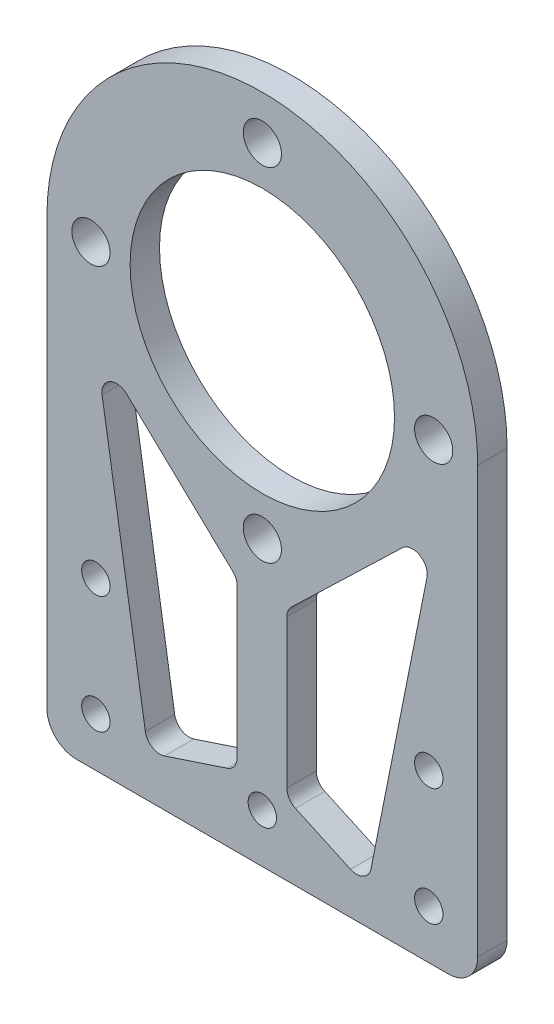
ISO-10303-21;
HEADER;
FILE_DESCRIPTION(('STEP AP214'),'2;1');
FILE_NAME('part.step','',(''),(''),'','','');
FILE_SCHEMA(('AUTOMOTIVE_DESIGN { 1 0 10303 214 1 1 1 1 }'));
ENDSEC;
DATA;
#1=APPLICATION_CONTEXT('core data for automotive mechanical design processes');
#2=APPLICATION_PROTOCOL_DEFINITION('international standard','automotive_design',2000,#1);
#3=PRODUCT_CONTEXT('',#1,'mechanical');
#4=PRODUCT('Part','Part','',(#3));
#5=PRODUCT_RELATED_PRODUCT_CATEGORY('part','',(#4));
#6=PRODUCT_DEFINITION_FORMATION('','',#4);
#7=PRODUCT_DEFINITION_CONTEXT('part definition',#1,'design');
#8=PRODUCT_DEFINITION('design','',#6,#7);
#9=PRODUCT_DEFINITION_SHAPE('','',#8);
#10=(LENGTH_UNIT() NAMED_UNIT(*) SI_UNIT(.MILLI.,.METRE.));
#11=(NAMED_UNIT(*) PLANE_ANGLE_UNIT() SI_UNIT($,.RADIAN.));
#12=(NAMED_UNIT(*) SI_UNIT($,.STERADIAN.) SOLID_ANGLE_UNIT());
#13=UNCERTAINTY_MEASURE_WITH_UNIT(LENGTH_MEASURE(1.E-05),#10,'distance_accuracy_value','');
#14=(GEOMETRIC_REPRESENTATION_CONTEXT(3) GLOBAL_UNCERTAINTY_ASSIGNED_CONTEXT((#13)) GLOBAL_UNIT_ASSIGNED_CONTEXT((#10,
#11,#12)) REPRESENTATION_CONTEXT('',''));
#15=CARTESIAN_POINT('',(0.,0.,0.));
#16=DIRECTION('',(0.,0.,1.));
#17=DIRECTION('',(1.,0.,0.));
#18=AXIS2_PLACEMENT_3D('',#15,#16,#17);
#19=CARTESIAN_POINT('',(0.,0.,3.));
#20=DIRECTION('',(0.,0.,-1.));
#21=DIRECTION('',(-1.,0.,0.));
#22=AXIS2_PLACEMENT_3D('',#19,#20,#21);
#23=PLANE('',#22);
#24=DIRECTION('',(0.,-1.,0.));
#25=VECTOR('',#24,1.);
#26=CARTESIAN_POINT('',(2.50919936973908,-39.2552582168169,3.));
#27=LINE('',#26,#25);
#28=CARTESIAN_POINT('',(2.50919936973908,-23.1406569979739,3.));
#29=VERTEX_POINT('',#28);
#30=CARTESIAN_POINT('',(2.50919936973908,-38.2924324984114,3.));
#31=VERTEX_POINT('',#30);
#32=EDGE_CURVE('E391',#29,#31,#27,.T.);
#33=ORIENTED_EDGE('',*,*,#32,.F.);
#34=CARTESIAN_POINT('',(4.00919936973908,-23.1406569979739,3.));
#35=DIRECTION('',(0.,0.,-1.));
#36=DIRECTION('',(-1.,0.,0.));
#37=AXIS2_PLACEMENT_3D('',#34,#35,#36);
#38=CIRCLE('',#37,1.5);
#39=CARTESIAN_POINT('',(2.96887558772357,-22.0600430851572,3.));
#40=VERTEX_POINT('',#39);
#41=EDGE_CURVE('E368',#29,#40,#38,.T.);
#42=ORIENTED_EDGE('',*,*,#41,.T.);
#43=DIRECTION('',(-0.720409275211112,-0.693549188010339,0.));
#44=VECTOR('',#43,1.);
#45=CARTESIAN_POINT('',(2.50919936973908,-22.5025805131177,3.));
#46=LINE('',#45,#44);
#47=CARTESIAN_POINT('',(14.3041304697697,-11.1474173183255,3.));
#48=VERTEX_POINT('',#47);
#49=EDGE_CURVE('E416',#48,#40,#46,.T.);
#50=ORIENTED_EDGE('',*,*,#49,.F.);
#51=CARTESIAN_POINT('',(15.3444542517852,-12.2280312311422,3.));
#52=DIRECTION('',(0.,0.,-1.));
#53=DIRECTION('',(-1.,0.,0.));
#54=AXIS2_PLACEMENT_3D('',#51,#52,#53);
#55=CIRCLE('',#54,1.5);
#56=CARTESIAN_POINT('',(16.8154260270854,-12.5217011755871,3.));
#57=VERTEX_POINT('',#56);
#58=EDGE_CURVE('E356',#48,#57,#55,.T.);
#59=ORIENTED_EDGE('',*,*,#58,.T.);
#60=DIRECTION('',(0.195779962963301,0.980647850200105,0.));
#61=VECTOR('',#60,1.);
#62=CARTESIAN_POINT('',(17.752585540904,-7.82753611083484,3.));
#63=LINE('',#62,#61);
#64=CARTESIAN_POINT('',(11.098132785501,-41.1592146445946,3.));
#65=VERTEX_POINT('',#64);
#66=EDGE_CURVE('E381',#65,#57,#63,.T.);
#67=ORIENTED_EDGE('',*,*,#66,.F.);
#68=CARTESIAN_POINT('',(9.62716101020085,-40.8655447001496,3.));
#69=DIRECTION('',(0.,0.,-1.));
#70=DIRECTION('',(-1.,0.,0.));
#71=AXIS2_PLACEMENT_3D('',#68,#69,#70);
#72=CIRCLE('',#71,1.5);
#73=CARTESIAN_POINT('',(9.00253743009069,-42.2293061833901,3.));
#74=VERTEX_POINT('',#73);
#75=EDGE_CURVE('E53',#65,#74,#72,.T.);
#76=ORIENTED_EDGE('',*,*,#75,.T.);
#77=DIRECTION('',(0.909174322160343,-0.41641572007344,0.));
#78=VECTOR('',#77,1.);
#79=CARTESIAN_POINT('',(10.7268273056346,-43.0190572714255,3.));
#80=LINE('',#79,#78);
#81=CARTESIAN_POINT('',(3.38457578962892,-39.6561939816519,3.));
#82=VERTEX_POINT('',#81);
#83=EDGE_CURVE('E379',#82,#74,#80,.T.);
#84=ORIENTED_EDGE('',*,*,#83,.F.);
#85=CARTESIAN_POINT('',(4.00919936973908,-38.2924324984114,3.));
#86=DIRECTION('',(0.,0.,-1.));
#87=DIRECTION('',(-1.,0.,0.));
#88=AXIS2_PLACEMENT_3D('',#85,#86,#87);
#89=CIRCLE('',#88,1.5);
#90=EDGE_CURVE('E362',#82,#31,#89,.T.);
#91=ORIENTED_EDGE('',*,*,#90,.T.);
#92=EDGE_LOOP('',(#33,#42,#50,#59,#67,#76,#84,#91));
#93=FACE_BOUND('',#92,.T.);
#94=DIRECTION('',(0.949335979246392,0.314262944853978,0.));
#95=VECTOR('',#94,1.);
#96=CARTESIAN_POINT('',(-2.57192935398256,-39.2552582168169,3.));
#97=LINE('',#96,#95);
#98=CARTESIAN_POINT('',(-9.99405361012429,-41.7122372809189,3.));
#99=VERTEX_POINT('',#98);
#100=CARTESIAN_POINT('',(-3.6005349367016,-39.5957621338549,3.));
#101=VERTEX_POINT('',#100);
#102=EDGE_CURVE('E435',#99,#101,#97,.T.);
#103=ORIENTED_EDGE('',*,*,#102,.F.);
#104=CARTESIAN_POINT('',(-10.4654480274053,-40.2882333120494,3.));
#105=DIRECTION('',(0.,0.,-1.));
#106=DIRECTION('',(-1.,0.,0.));
#107=AXIS2_PLACEMENT_3D('',#104,#105,#106);
#108=CIRCLE('',#107,1.5);
#109=CARTESIAN_POINT('',(-11.9465745365671,-40.5254342055092,3.));
#110=VERTEX_POINT('',#109);
#111=EDGE_CURVE('E350',#99,#110,#108,.T.);
#112=ORIENTED_EDGE('',*,*,#111,.T.);
#113=DIRECTION('',(0.158133928973205,-0.987417672774545,0.));
#114=VECTOR('',#113,1.);
#115=CARTESIAN_POINT('',(-11.6677770692867,-42.2662974605038,3.));
#116=LINE('',#115,#114);
#117=CARTESIAN_POINT('',(-16.3622220573192,-12.9533095701148,3.));
#118=VERTEX_POINT('',#117);
#119=EDGE_CURVE('E420',#118,#110,#116,.T.);
#120=ORIENTED_EDGE('',*,*,#119,.F.);
#121=CARTESIAN_POINT('',(-14.8810955481574,-12.716108676655,3.));
#122=DIRECTION('',(0.,0.,-1.));
#123=DIRECTION('',(-1.,0.,0.));
#124=AXIS2_PLACEMENT_3D('',#121,#122,#123);
#125=CIRCLE('',#124,1.5);
#126=CARTESIAN_POINT('',(-13.8489581736435,-11.6276728998949,3.));
#127=VERTEX_POINT('',#126);
#128=EDGE_CURVE('E332',#118,#127,#125,.T.);
#129=ORIENTED_EDGE('',*,*,#128,.T.);
#130=DIRECTION('',(-0.725623851173442,0.688091583009284,0.));
#131=VECTOR('',#130,1.);
#132=CARTESIAN_POINT('',(-17.0625557142258,-8.58029592175657,3.));
#133=LINE('',#132,#131);
#134=CARTESIAN_POINT('',(-3.03979197946864,-21.8777442909225,3.));
#135=VERTEX_POINT('',#134);
#136=EDGE_CURVE('E426',#135,#127,#133,.T.);
#137=ORIENTED_EDGE('',*,*,#136,.F.);
#138=CARTESIAN_POINT('',(-4.07192935398256,-22.9661800676827,3.));
#139=DIRECTION('',(0.,0.,-1.));
#140=DIRECTION('',(-1.,0.,0.));
#141=AXIS2_PLACEMENT_3D('',#138,#139,#140);
#142=CIRCLE('',#141,1.5);
#143=CARTESIAN_POINT('',(-2.57192935398256,-22.9661800676827,3.));
#144=VERTEX_POINT('',#143);
#145=EDGE_CURVE('E338',#135,#144,#142,.T.);
#146=ORIENTED_EDGE('',*,*,#145,.T.);
#147=DIRECTION('',(0.,1.,0.));
#148=VECTOR('',#147,1.);
#149=CARTESIAN_POINT('',(-2.57192935398256,-22.3214071254352,3.));
#150=LINE('',#149,#148);
#151=CARTESIAN_POINT('',(-2.57192935398256,-38.1717581649853,3.));
#152=VERTEX_POINT('',#151);
#153=EDGE_CURVE('E430',#152,#144,#150,.T.);
#154=ORIENTED_EDGE('',*,*,#153,.F.);
#155=CARTESIAN_POINT('',(-4.07192935398256,-38.1717581649853,3.));
#156=DIRECTION('',(0.,0.,-1.));
#157=DIRECTION('',(-1.,0.,0.));
#158=AXIS2_PLACEMENT_3D('',#155,#156,#157);
#159=CIRCLE('',#158,1.5);
#160=EDGE_CURVE('E344',#152,#101,#159,.T.);
#161=ORIENTED_EDGE('',*,*,#160,.T.);
#162=EDGE_LOOP('',(#103,#112,#120,#129,#137,#146,#154,#161));
#163=FACE_BOUND('',#162,.T.);
#164=CARTESIAN_POINT('',(17.,-29.5,3.));
#165=DIRECTION('',(0.,0.,1.));
#166=DIRECTION('',(1.,0.,0.));
#167=AXIS2_PLACEMENT_3D('',#164,#165,#166);
#168=CIRCLE('',#167,1.45);
#169=CARTESIAN_POINT('',(18.45,-29.5,3.));
#170=VERTEX_POINT('',#169);
#171=EDGE_CURVE('E405',#170,#170,#168,.T.);
#172=ORIENTED_EDGE('',*,*,#171,.F.);
#173=EDGE_LOOP('',(#172));
#174=FACE_BOUND('',#173,.T.);
#175=CARTESIAN_POINT('',(-17.,-29.5,3.));
#176=DIRECTION('',(0.,0.,1.));
#177=DIRECTION('',(1.,0.,0.));
#178=AXIS2_PLACEMENT_3D('',#175,#176,#177);
#179=CIRCLE('',#178,1.45);
#180=CARTESIAN_POINT('',(-15.55,-29.5,3.));
#181=VERTEX_POINT('',#180);
#182=EDGE_CURVE('E410',#181,#181,#179,.T.);
#183=ORIENTED_EDGE('',*,*,#182,.F.);
#184=EDGE_LOOP('',(#183));
#185=FACE_BOUND('',#184,.T.);
#186=CARTESIAN_POINT('',(-17.,-41.5,3.));
#187=DIRECTION('',(0.,0.,1.));
#188=DIRECTION('',(1.,0.,0.));
#189=AXIS2_PLACEMENT_3D('',#186,#187,#188);
#190=CIRCLE('',#189,1.45);
#191=CARTESIAN_POINT('',(-15.55,-41.5,3.));
#192=VERTEX_POINT('',#191);
#193=EDGE_CURVE('E461',#192,#192,#190,.T.);
#194=ORIENTED_EDGE('',*,*,#193,.F.);
#195=EDGE_LOOP('',(#194));
#196=FACE_BOUND('',#195,.T.);
#197=CARTESIAN_POINT('',(17.,-41.5,3.));
#198=DIRECTION('',(0.,0.,1.));
#199=DIRECTION('',(1.,0.,0.));
#200=AXIS2_PLACEMENT_3D('',#197,#198,#199);
#201=CIRCLE('',#200,1.45);
#202=CARTESIAN_POINT('',(18.45,-41.5,3.));
#203=VERTEX_POINT('',#202);
#204=EDGE_CURVE('E457',#203,#203,#201,.T.);
#205=ORIENTED_EDGE('',*,*,#204,.F.);
#206=EDGE_LOOP('',(#205));
#207=FACE_BOUND('',#206,.T.);
#208=CARTESIAN_POINT('',(0.,-41.5,3.));
#209=DIRECTION('',(0.,0.,1.));
#210=DIRECTION('',(1.,0.,0.));
#211=AXIS2_PLACEMENT_3D('',#208,#209,#210);
#212=CIRCLE('',#211,1.45);
#213=CARTESIAN_POINT('',(1.45,-41.5,3.));
#214=VERTEX_POINT('',#213);
#215=EDGE_CURVE('E239',#214,#214,#212,.T.);
#216=ORIENTED_EDGE('',*,*,#215,.F.);
#217=EDGE_LOOP('',(#216));
#218=FACE_BOUND('',#217,.T.);
#219=DIRECTION('',(0.,-1.,0.));
#220=VECTOR('',#219,1.);
#221=CARTESIAN_POINT('',(-22.,0.,3.));
#222=LINE('',#221,#220);
#223=CARTESIAN_POINT('',(-22.,0.,3.));
#224=VERTEX_POINT('',#223);
#225=CARTESIAN_POINT('',(-22.,-43.5,3.));
#226=VERTEX_POINT('',#225);
#227=EDGE_CURVE('E195',#224,#226,#222,.T.);
#228=ORIENTED_EDGE('',*,*,#227,.T.);
#229=CARTESIAN_POINT('',(-19.,-43.5,3.));
#230=DIRECTION('',(0.,0.,-1.));
#231=DIRECTION('',(-1.,0.,0.));
#232=AXIS2_PLACEMENT_3D('',#229,#230,#231);
#233=CIRCLE('',#232,3.);
#234=CARTESIAN_POINT('',(-19.,-46.5,3.));
#235=VERTEX_POINT('',#234);
#236=EDGE_CURVE('E270',#226,#235,#233,.F.);
#237=ORIENTED_EDGE('',*,*,#236,.T.);
#238=DIRECTION('',(1.,0.,0.));
#239=VECTOR('',#238,1.);
#240=CARTESIAN_POINT('',(-22.,-46.5,3.));
#241=LINE('',#240,#239);
#242=CARTESIAN_POINT('',(19.,-46.5,3.));
#243=VERTEX_POINT('',#242);
#244=EDGE_CURVE('E207',#235,#243,#241,.T.);
#245=ORIENTED_EDGE('',*,*,#244,.T.);
#246=CARTESIAN_POINT('',(19.,-43.5,3.));
#247=DIRECTION('',(0.,0.,-1.));
#248=DIRECTION('',(-1.,0.,0.));
#249=AXIS2_PLACEMENT_3D('',#246,#247,#248);
#250=CIRCLE('',#249,3.);
#251=CARTESIAN_POINT('',(22.,-43.5,3.));
#252=VERTEX_POINT('',#251);
#253=EDGE_CURVE('E267',#243,#252,#250,.F.);
#254=ORIENTED_EDGE('',*,*,#253,.T.);
#255=DIRECTION('',(0.,1.,0.));
#256=VECTOR('',#255,1.);
#257=CARTESIAN_POINT('',(22.,-46.5,3.));
#258=LINE('',#257,#256);
#259=CARTESIAN_POINT('',(22.,0.,3.));
#260=VERTEX_POINT('',#259);
#261=EDGE_CURVE('E213',#252,#260,#258,.T.);
#262=ORIENTED_EDGE('',*,*,#261,.T.);
#263=CARTESIAN_POINT('',(0.,0.,3.));
#264=DIRECTION('',(0.,0.,1.));
#265=DIRECTION('',(-1.,0.,0.));
#266=AXIS2_PLACEMENT_3D('',#263,#264,#265);
#267=CIRCLE('',#266,22.);
#268=EDGE_CURVE('E208',#260,#224,#267,.T.);
#269=ORIENTED_EDGE('',*,*,#268,.T.);
#270=EDGE_LOOP('',(#228,#237,#245,#254,#262,#269));
#271=FACE_BOUND('',#270,.T.);
#272=CARTESIAN_POINT('',(0.,0.,3.));
#273=DIRECTION('',(0.,0.,1.));
#274=DIRECTION('',(1.,0.,0.));
#275=AXIS2_PLACEMENT_3D('',#272,#273,#274);
#276=CIRCLE('',#275,13.5);
#277=CARTESIAN_POINT('',(13.5,0.,3.));
#278=VERTEX_POINT('',#277);
#279=EDGE_CURVE('E503',#278,#278,#276,.T.);
#280=ORIENTED_EDGE('',*,*,#279,.F.);
#281=EDGE_LOOP('',(#280));
#282=FACE_BOUND('',#281,.T.);
#283=CARTESIAN_POINT('',(0.,17.5,3.));
#284=DIRECTION('',(0.,0.,1.));
#285=DIRECTION('',(1.,0.,0.));
#286=AXIS2_PLACEMENT_3D('',#283,#284,#285);
#287=CIRCLE('',#286,1.95);
#288=CARTESIAN_POINT('',(1.95,17.5,3.));
#289=VERTEX_POINT('',#288);
#290=EDGE_CURVE('E495',#289,#289,#287,.T.);
#291=ORIENTED_EDGE('',*,*,#290,.F.);
#292=EDGE_LOOP('',(#291));
#293=FACE_BOUND('',#292,.T.);
#294=CARTESIAN_POINT('',(17.5,0.,3.));
#295=DIRECTION('',(0.,0.,1.));
#296=DIRECTION('',(1.,0.,0.));
#297=AXIS2_PLACEMENT_3D('',#294,#295,#296);
#298=CIRCLE('',#297,1.95);
#299=CARTESIAN_POINT('',(19.45,0.,3.));
#300=VERTEX_POINT('',#299);
#301=EDGE_CURVE('E487',#300,#300,#298,.T.);
#302=ORIENTED_EDGE('',*,*,#301,.F.);
#303=EDGE_LOOP('',(#302));
#304=FACE_BOUND('',#303,.T.);
#305=CARTESIAN_POINT('',(-17.5,0.,3.));
#306=DIRECTION('',(0.,0.,1.));
#307=DIRECTION('',(1.,0.,0.));
#308=AXIS2_PLACEMENT_3D('',#305,#306,#307);
#309=CIRCLE('',#308,1.95);
#310=CARTESIAN_POINT('',(-15.55,0.,3.));
#311=VERTEX_POINT('',#310);
#312=EDGE_CURVE('E479',#311,#311,#309,.T.);
#313=ORIENTED_EDGE('',*,*,#312,.F.);
#314=EDGE_LOOP('',(#313));
#315=FACE_BOUND('',#314,.T.);
#316=CARTESIAN_POINT('',(0.,-17.5,3.));
#317=DIRECTION('',(0.,0.,1.));
#318=DIRECTION('',(1.,0.,0.));
#319=AXIS2_PLACEMENT_3D('',#316,#317,#318);
#320=CIRCLE('',#319,1.95);
#321=CARTESIAN_POINT('',(1.95,-17.5,3.));
#322=VERTEX_POINT('',#321);
#323=EDGE_CURVE('E471',#322,#322,#320,.T.);
#324=ORIENTED_EDGE('',*,*,#323,.F.);
#325=EDGE_LOOP('',(#324));
#326=FACE_BOUND('',#325,.T.);
#327=ADVANCED_FACE('F44',(#93,#163,#174,#185,#196,#207,#218,#271,#282,#293,#304,#315,#326),#23,.F.);
#328=CARTESIAN_POINT('',(0.,0.,0.));
#329=DIRECTION('',(0.,0.,-1.));
#330=DIRECTION('',(-1.,0.,0.));
#331=AXIS2_PLACEMENT_3D('',#328,#329,#330);
#332=PLANE('',#331);
#333=DIRECTION('',(0.195779962963301,0.980647850200105,0.));
#334=VECTOR('',#333,1.);
#335=CARTESIAN_POINT('',(17.752585540904,-7.82753611083484,0.));
#336=LINE('',#335,#334);
#337=CARTESIAN_POINT('',(11.098132785501,-41.1592146445946,0.));
#338=VERTEX_POINT('',#337);
#339=CARTESIAN_POINT('',(16.8154260270854,-12.5217011755871,0.));
#340=VERTEX_POINT('',#339);
#341=EDGE_CURVE('E398',#338,#340,#336,.T.);
#342=ORIENTED_EDGE('',*,*,#341,.T.);
#343=CARTESIAN_POINT('',(15.3444542517852,-12.2280312311422,0.));
#344=DIRECTION('',(0.,0.,-1.));
#345=DIRECTION('',(-1.,0.,0.));
#346=AXIS2_PLACEMENT_3D('',#343,#344,#345);
#347=CIRCLE('',#346,1.5);
#348=CARTESIAN_POINT('',(14.3041304697697,-11.1474173183255,0.));
#349=VERTEX_POINT('',#348);
#350=EDGE_CURVE('E359',#340,#349,#347,.F.);
#351=ORIENTED_EDGE('',*,*,#350,.T.);
#352=DIRECTION('',(-0.720409275211112,-0.693549188010339,0.));
#353=VECTOR('',#352,1.);
#354=CARTESIAN_POINT('',(2.50919936973908,-22.5025805131177,0.));
#355=LINE('',#354,#353);
#356=CARTESIAN_POINT('',(2.96887558772357,-22.0600430851572,0.));
#357=VERTEX_POINT('',#356);
#358=EDGE_CURVE('E425',#349,#357,#355,.T.);
#359=ORIENTED_EDGE('',*,*,#358,.T.);
#360=CARTESIAN_POINT('',(4.00919936973908,-23.1406569979739,0.));
#361=DIRECTION('',(0.,0.,-1.));
#362=DIRECTION('',(-1.,0.,0.));
#363=AXIS2_PLACEMENT_3D('',#360,#361,#362);
#364=CIRCLE('',#363,1.5);
#365=CARTESIAN_POINT('',(2.50919936973908,-23.1406569979739,0.));
#366=VERTEX_POINT('',#365);
#367=EDGE_CURVE('E67',#357,#366,#364,.F.);
#368=ORIENTED_EDGE('',*,*,#367,.T.);
#369=DIRECTION('',(0.,-1.,0.));
#370=VECTOR('',#369,1.);
#371=CARTESIAN_POINT('',(2.50919936973908,-39.2552582168169,0.));
#372=LINE('',#371,#370);
#373=CARTESIAN_POINT('',(2.50919936973908,-38.2924324984114,0.));
#374=VERTEX_POINT('',#373);
#375=EDGE_CURVE('E412',#366,#374,#372,.T.);
#376=ORIENTED_EDGE('',*,*,#375,.T.);
#377=CARTESIAN_POINT('',(4.00919936973908,-38.2924324984114,0.));
#378=DIRECTION('',(0.,0.,-1.));
#379=DIRECTION('',(-1.,0.,0.));
#380=AXIS2_PLACEMENT_3D('',#377,#378,#379);
#381=CIRCLE('',#380,1.5);
#382=CARTESIAN_POINT('',(3.38457578962892,-39.6561939816519,0.));
#383=VERTEX_POINT('',#382);
#384=EDGE_CURVE('E365',#374,#383,#381,.F.);
#385=ORIENTED_EDGE('',*,*,#384,.T.);
#386=DIRECTION('',(0.909174322160343,-0.41641572007344,0.));
#387=VECTOR('',#386,1.);
#388=CARTESIAN_POINT('',(10.7268273056346,-43.0190572714255,0.));
#389=LINE('',#388,#387);
#390=CARTESIAN_POINT('',(9.00253743009069,-42.2293061833901,0.));
#391=VERTEX_POINT('',#390);
#392=EDGE_CURVE('E400',#383,#391,#389,.T.);
#393=ORIENTED_EDGE('',*,*,#392,.T.);
#394=CARTESIAN_POINT('',(9.62716101020085,-40.8655447001496,0.));
#395=DIRECTION('',(0.,0.,-1.));
#396=DIRECTION('',(-1.,0.,0.));
#397=AXIS2_PLACEMENT_3D('',#394,#395,#396);
#398=CIRCLE('',#397,1.5);
#399=EDGE_CURVE('E11',#391,#338,#398,.F.);
#400=ORIENTED_EDGE('',*,*,#399,.T.);
#401=EDGE_LOOP('',(#342,#351,#359,#368,#376,#385,#393,#400));
#402=FACE_BOUND('',#401,.T.);
#403=DIRECTION('',(-0.725623851173442,0.688091583009284,0.));
#404=VECTOR('',#403,1.);
#405=CARTESIAN_POINT('',(-17.0625557142258,-8.58029592175657,0.));
#406=LINE('',#405,#404);
#407=CARTESIAN_POINT('',(-3.03979197946864,-21.8777442909225,0.));
#408=VERTEX_POINT('',#407);
#409=CARTESIAN_POINT('',(-13.8489581736435,-11.6276728998949,0.));
#410=VERTEX_POINT('',#409);
#411=EDGE_CURVE('E442',#408,#410,#406,.T.);
#412=ORIENTED_EDGE('',*,*,#411,.T.);
#413=CARTESIAN_POINT('',(-14.8810955481574,-12.716108676655,0.));
#414=DIRECTION('',(0.,0.,-1.));
#415=DIRECTION('',(-1.,0.,0.));
#416=AXIS2_PLACEMENT_3D('',#413,#414,#415);
#417=CIRCLE('',#416,1.5);
#418=CARTESIAN_POINT('',(-16.3622220573192,-12.9533095701148,0.));
#419=VERTEX_POINT('',#418);
#420=EDGE_CURVE('E335',#410,#419,#417,.F.);
#421=ORIENTED_EDGE('',*,*,#420,.T.);
#422=DIRECTION('',(0.158133928973205,-0.987417672774545,0.));
#423=VECTOR('',#422,1.);
#424=CARTESIAN_POINT('',(-11.6677770692867,-42.2662974605038,0.));
#425=LINE('',#424,#423);
#426=CARTESIAN_POINT('',(-11.9465745365671,-40.5254342055092,0.));
#427=VERTEX_POINT('',#426);
#428=EDGE_CURVE('E431',#419,#427,#425,.T.);
#429=ORIENTED_EDGE('',*,*,#428,.T.);
#430=CARTESIAN_POINT('',(-10.4654480274053,-40.2882333120494,0.));
#431=DIRECTION('',(0.,0.,-1.));
#432=DIRECTION('',(-1.,0.,0.));
#433=AXIS2_PLACEMENT_3D('',#430,#431,#432);
#434=CIRCLE('',#433,1.5);
#435=CARTESIAN_POINT('',(-9.99405361012429,-41.7122372809189,0.));
#436=VERTEX_POINT('',#435);
#437=EDGE_CURVE('E353',#427,#436,#434,.F.);
#438=ORIENTED_EDGE('',*,*,#437,.T.);
#439=DIRECTION('',(0.949335979246392,0.314262944853978,0.));
#440=VECTOR('',#439,1.);
#441=CARTESIAN_POINT('',(-2.57192935398256,-39.2552582168169,0.));
#442=LINE('',#441,#440);
#443=CARTESIAN_POINT('',(-3.6005349367016,-39.5957621338549,0.));
#444=VERTEX_POINT('',#443);
#445=EDGE_CURVE('E450',#436,#444,#442,.T.);
#446=ORIENTED_EDGE('',*,*,#445,.T.);
#447=CARTESIAN_POINT('',(-4.07192935398256,-38.1717581649853,0.));
#448=DIRECTION('',(0.,0.,-1.));
#449=DIRECTION('',(-1.,0.,0.));
#450=AXIS2_PLACEMENT_3D('',#447,#448,#449);
#451=CIRCLE('',#450,1.5);
#452=CARTESIAN_POINT('',(-2.57192935398256,-38.1717581649853,0.));
#453=VERTEX_POINT('',#452);
#454=EDGE_CURVE('E347',#444,#453,#451,.F.);
#455=ORIENTED_EDGE('',*,*,#454,.T.);
#456=DIRECTION('',(0.,1.,0.));
#457=VECTOR('',#456,1.);
#458=CARTESIAN_POINT('',(-2.57192935398256,-22.3214071254352,0.));
#459=LINE('',#458,#457);
#460=CARTESIAN_POINT('',(-2.57192935398256,-22.9661800676827,0.));
#461=VERTEX_POINT('',#460);
#462=EDGE_CURVE('E446',#453,#461,#459,.T.);
#463=ORIENTED_EDGE('',*,*,#462,.T.);
#464=CARTESIAN_POINT('',(-4.07192935398256,-22.9661800676827,0.));
#465=DIRECTION('',(0.,0.,-1.));
#466=DIRECTION('',(-1.,0.,0.));
#467=AXIS2_PLACEMENT_3D('',#464,#465,#466);
#468=CIRCLE('',#467,1.5);
#469=EDGE_CURVE('E341',#461,#408,#468,.F.);
#470=ORIENTED_EDGE('',*,*,#469,.T.);
#471=EDGE_LOOP('',(#412,#421,#429,#438,#446,#455,#463,#470));
#472=FACE_BOUND('',#471,.T.);
#473=CARTESIAN_POINT('',(17.,-29.5,0.));
#474=DIRECTION('',(0.,0.,-1.));
#475=DIRECTION('',(-1.,0.,0.));
#476=AXIS2_PLACEMENT_3D('',#473,#474,#475);
#477=CIRCLE('',#476,1.45);
#478=CARTESIAN_POINT('',(15.55,-29.5,0.));
#479=VERTEX_POINT('',#478);
#480=EDGE_CURVE('E251',#479,#479,#477,.T.);
#481=ORIENTED_EDGE('',*,*,#480,.F.);
#482=EDGE_LOOP('',(#481));
#483=FACE_BOUND('',#482,.T.);
#484=CARTESIAN_POINT('',(-17.,-29.5,0.));
#485=DIRECTION('',(0.,0.,-1.));
#486=DIRECTION('',(-1.,0.,0.));
#487=AXIS2_PLACEMENT_3D('',#484,#485,#486);
#488=CIRCLE('',#487,1.45);
#489=CARTESIAN_POINT('',(-18.45,-29.5,0.));
#490=VERTEX_POINT('',#489);
#491=EDGE_CURVE('E247',#490,#490,#488,.T.);
#492=ORIENTED_EDGE('',*,*,#491,.F.);
#493=EDGE_LOOP('',(#492));
#494=FACE_BOUND('',#493,.T.);
#495=CARTESIAN_POINT('',(-17.,-41.5,0.));
#496=DIRECTION('',(0.,0.,-1.));
#497=DIRECTION('',(-1.,0.,0.));
#498=AXIS2_PLACEMENT_3D('',#495,#496,#497);
#499=CIRCLE('',#498,1.45);
#500=CARTESIAN_POINT('',(-18.45,-41.5,0.));
#501=VERTEX_POINT('',#500);
#502=EDGE_CURVE('E243',#501,#501,#499,.T.);
#503=ORIENTED_EDGE('',*,*,#502,.F.);
#504=EDGE_LOOP('',(#503));
#505=FACE_BOUND('',#504,.T.);
#506=CARTESIAN_POINT('',(17.,-41.5,0.));
#507=DIRECTION('',(0.,0.,-1.));
#508=DIRECTION('',(-1.,0.,0.));
#509=AXIS2_PLACEMENT_3D('',#506,#507,#508);
#510=CIRCLE('',#509,1.45);
#511=CARTESIAN_POINT('',(15.55,-41.5,0.));
#512=VERTEX_POINT('',#511);
#513=EDGE_CURVE('E238',#512,#512,#510,.T.);
#514=ORIENTED_EDGE('',*,*,#513,.F.);
#515=EDGE_LOOP('',(#514));
#516=FACE_BOUND('',#515,.T.);
#517=CARTESIAN_POINT('',(0.,-41.5,0.));
#518=DIRECTION('',(0.,0.,-1.));
#519=DIRECTION('',(-1.,0.,0.));
#520=AXIS2_PLACEMENT_3D('',#517,#518,#519);
#521=CIRCLE('',#520,1.45);
#522=CARTESIAN_POINT('',(-1.45,-41.5,0.));
#523=VERTEX_POINT('',#522);
#524=EDGE_CURVE('E234',#523,#523,#521,.T.);
#525=ORIENTED_EDGE('',*,*,#524,.F.);
#526=EDGE_LOOP('',(#525));
#527=FACE_BOUND('',#526,.T.);
#528=CARTESIAN_POINT('',(-17.5,0.,0.));
#529=DIRECTION('',(0.,0.,1.));
#530=DIRECTION('',(1.,0.,0.));
#531=AXIS2_PLACEMENT_3D('',#528,#529,#530);
#532=CIRCLE('',#531,1.95);
#533=CARTESIAN_POINT('',(-15.55,0.,0.));
#534=VERTEX_POINT('',#533);
#535=EDGE_CURVE('E475',#534,#534,#532,.T.);
#536=ORIENTED_EDGE('',*,*,#535,.T.);
#537=EDGE_LOOP('',(#536));
#538=FACE_BOUND('',#537,.T.);
#539=CARTESIAN_POINT('',(0.,17.5,0.));
#540=DIRECTION('',(0.,0.,1.));
#541=DIRECTION('',(1.,0.,0.));
#542=AXIS2_PLACEMENT_3D('',#539,#540,#541);
#543=CIRCLE('',#542,1.95);
#544=CARTESIAN_POINT('',(1.95,17.5,0.));
#545=VERTEX_POINT('',#544);
#546=EDGE_CURVE('E491',#545,#545,#543,.T.);
#547=ORIENTED_EDGE('',*,*,#546,.T.);
#548=EDGE_LOOP('',(#547));
#549=FACE_BOUND('',#548,.T.);
#550=DIRECTION('',(1.,0.,0.));
#551=VECTOR('',#550,1.);
#552=CARTESIAN_POINT('',(-22.,-46.5,0.));
#553=LINE('',#552,#551);
#554=CARTESIAN_POINT('',(-19.,-46.5,0.));
#555=VERTEX_POINT('',#554);
#556=CARTESIAN_POINT('',(19.,-46.5,0.));
#557=VERTEX_POINT('',#556);
#558=EDGE_CURVE('E520',#555,#557,#553,.T.);
#559=ORIENTED_EDGE('',*,*,#558,.F.);
#560=CARTESIAN_POINT('',(-19.,-43.5,0.));
#561=DIRECTION('',(0.,0.,-1.));
#562=DIRECTION('',(-1.,0.,0.));
#563=AXIS2_PLACEMENT_3D('',#560,#561,#562);
#564=CIRCLE('',#563,3.);
#565=CARTESIAN_POINT('',(-22.,-43.5,0.));
#566=VERTEX_POINT('',#565);
#567=EDGE_CURVE('E262',#555,#566,#564,.T.);
#568=ORIENTED_EDGE('',*,*,#567,.T.);
#569=DIRECTION('',(0.,-1.,0.));
#570=VECTOR('',#569,1.);
#571=CARTESIAN_POINT('',(-22.,0.,0.));
#572=LINE('',#571,#570);
#573=CARTESIAN_POINT('',(-22.,0.,0.));
#574=VERTEX_POINT('',#573);
#575=EDGE_CURVE('E517',#574,#566,#572,.T.);
#576=ORIENTED_EDGE('',*,*,#575,.F.);
#577=CARTESIAN_POINT('',(0.,0.,0.));
#578=DIRECTION('',(0.,0.,1.));
#579=DIRECTION('',(-1.,0.,0.));
#580=AXIS2_PLACEMENT_3D('',#577,#578,#579);
#581=CIRCLE('',#580,22.);
#582=CARTESIAN_POINT('',(22.,0.,0.));
#583=VERTEX_POINT('',#582);
#584=EDGE_CURVE('E222',#583,#574,#581,.T.);
#585=ORIENTED_EDGE('',*,*,#584,.F.);
#586=DIRECTION('',(0.,1.,0.));
#587=VECTOR('',#586,1.);
#588=CARTESIAN_POINT('',(22.,-46.5,0.));
#589=LINE('',#588,#587);
#590=CARTESIAN_POINT('',(22.,-43.5,0.));
#591=VERTEX_POINT('',#590);
#592=EDGE_CURVE('E218',#591,#583,#589,.T.);
#593=ORIENTED_EDGE('',*,*,#592,.F.);
#594=CARTESIAN_POINT('',(19.,-43.5,0.));
#595=DIRECTION('',(0.,0.,-1.));
#596=DIRECTION('',(-1.,0.,0.));
#597=AXIS2_PLACEMENT_3D('',#594,#595,#596);
#598=CIRCLE('',#597,3.);
#599=EDGE_CURVE('E259',#591,#557,#598,.T.);
#600=ORIENTED_EDGE('',*,*,#599,.T.);
#601=EDGE_LOOP('',(#559,#568,#576,#585,#593,#600));
#602=FACE_BOUND('',#601,.T.);
#603=CARTESIAN_POINT('',(0.,0.,0.));
#604=DIRECTION('',(0.,0.,1.));
#605=DIRECTION('',(1.,0.,0.));
#606=AXIS2_PLACEMENT_3D('',#603,#604,#605);
#607=CIRCLE('',#606,13.5);
#608=CARTESIAN_POINT('',(13.5,0.,0.));
#609=VERTEX_POINT('',#608);
#610=EDGE_CURVE('E499',#609,#609,#607,.T.);
#611=ORIENTED_EDGE('',*,*,#610,.T.);
#612=EDGE_LOOP('',(#611));
#613=FACE_BOUND('',#612,.T.);
#614=CARTESIAN_POINT('',(17.5,0.,0.));
#615=DIRECTION('',(0.,0.,1.));
#616=DIRECTION('',(1.,0.,0.));
#617=AXIS2_PLACEMENT_3D('',#614,#615,#616);
#618=CIRCLE('',#617,1.95);
#619=CARTESIAN_POINT('',(19.45,0.,0.));
#620=VERTEX_POINT('',#619);
#621=EDGE_CURVE('E483',#620,#620,#618,.T.);
#622=ORIENTED_EDGE('',*,*,#621,.T.);
#623=EDGE_LOOP('',(#622));
#624=FACE_BOUND('',#623,.T.);
#625=CARTESIAN_POINT('',(0.,-17.5,0.));
#626=DIRECTION('',(0.,0.,1.));
#627=DIRECTION('',(1.,0.,0.));
#628=AXIS2_PLACEMENT_3D('',#625,#626,#627);
#629=CIRCLE('',#628,1.95);
#630=CARTESIAN_POINT('',(1.95,-17.5,0.));
#631=VERTEX_POINT('',#630);
#632=EDGE_CURVE('E254',#631,#631,#629,.T.);
#633=ORIENTED_EDGE('',*,*,#632,.T.);
#634=EDGE_LOOP('',(#633));
#635=FACE_BOUND('',#634,.T.);
#636=ADVANCED_FACE('F396',(#402,#472,#483,#494,#505,#516,#527,#538,#549,#602,#613,#624,#635),
#332,.T.);
#637=CARTESIAN_POINT('',(0.,0.,3.));
#638=DIRECTION('',(0.,0.,-1.));
#639=DIRECTION('',(-1.,0.,0.));
#640=AXIS2_PLACEMENT_3D('',#637,#638,#639);
#641=CYLINDRICAL_SURFACE('',#640,22.);
#642=ORIENTED_EDGE('',*,*,#584,.T.);
#643=DIRECTION('',(0.,0.,-1.));
#644=VECTOR('',#643,1.);
#645=CARTESIAN_POINT('',(-22.,0.,3.));
#646=LINE('',#645,#644);
#647=EDGE_CURVE('E200',#224,#574,#646,.T.);
#648=ORIENTED_EDGE('',*,*,#647,.F.);
#649=ORIENTED_EDGE('',*,*,#268,.F.);
#650=DIRECTION('',(0.,0.,-1.));
#651=VECTOR('',#650,1.);
#652=CARTESIAN_POINT('',(22.,0.,3.));
#653=LINE('',#652,#651);
#654=EDGE_CURVE('E225',#260,#583,#653,.T.);
#655=ORIENTED_EDGE('',*,*,#654,.T.);
#656=EDGE_LOOP('',(#642,#648,#649,#655));
#657=FACE_BOUND('',#656,.T.);
#658=ADVANCED_FACE('F220',(#657),#641,.T.);
#659=CARTESIAN_POINT('',(-22.,0.,3.));
#660=DIRECTION('',(1.,0.,0.));
#661=DIRECTION('',(0.,1.,0.));
#662=AXIS2_PLACEMENT_3D('',#659,#660,#661);
#663=PLANE('',#662);
#664=ORIENTED_EDGE('',*,*,#575,.T.);
#665=DIRECTION('',(0.,0.,-1.));
#666=VECTOR('',#665,1.);
#667=CARTESIAN_POINT('',(-22.,-43.5,3.));
#668=LINE('',#667,#666);
#669=EDGE_CURVE('E203',#566,#226,#668,.F.);
#670=ORIENTED_EDGE('',*,*,#669,.T.);
#671=ORIENTED_EDGE('',*,*,#227,.F.);
#672=ORIENTED_EDGE('',*,*,#647,.T.);
#673=EDGE_LOOP('',(#664,#670,#671,#672));
#674=FACE_BOUND('',#673,.T.);
#675=ADVANCED_FACE('F198',(#674),#663,.F.);
#676=CARTESIAN_POINT('',(-22.,-46.5,3.));
#677=DIRECTION('',(0.,1.,0.));
#678=DIRECTION('',(0.,0.,1.));
#679=AXIS2_PLACEMENT_3D('',#676,#677,#678);
#680=PLANE('',#679);
#681=ORIENTED_EDGE('',*,*,#244,.F.);
#682=DIRECTION('',(0.,0.,-1.));
#683=VECTOR('',#682,1.);
#684=CARTESIAN_POINT('',(-19.,-46.5,3.));
#685=LINE('',#684,#683);
#686=EDGE_CURVE('E229',#235,#555,#685,.T.);
#687=ORIENTED_EDGE('',*,*,#686,.T.);
#688=ORIENTED_EDGE('',*,*,#558,.T.);
#689=DIRECTION('',(0.,0.,-1.));
#690=VECTOR('',#689,1.);
#691=CARTESIAN_POINT('',(19.,-46.5,3.));
#692=LINE('',#691,#690);
#693=EDGE_CURVE('E224',#557,#243,#692,.F.);
#694=ORIENTED_EDGE('',*,*,#693,.T.);
#695=EDGE_LOOP('',(#681,#687,#688,#694));
#696=FACE_BOUND('',#695,.T.);
#697=ADVANCED_FACE('F537',(#696),#680,.F.);
#698=CARTESIAN_POINT('',(22.,-46.5,3.));
#699=DIRECTION('',(-1.,0.,0.));
#700=DIRECTION('',(0.,-1.,0.));
#701=AXIS2_PLACEMENT_3D('',#698,#699,#700);
#702=PLANE('',#701);
#703=ORIENTED_EDGE('',*,*,#261,.F.);
#704=DIRECTION('',(0.,0.,-1.));
#705=VECTOR('',#704,1.);
#706=CARTESIAN_POINT('',(22.,-43.5,3.));
#707=LINE('',#706,#705);
#708=EDGE_CURVE('E273',#252,#591,#707,.T.);
#709=ORIENTED_EDGE('',*,*,#708,.T.);
#710=ORIENTED_EDGE('',*,*,#592,.T.);
#711=ORIENTED_EDGE('',*,*,#654,.F.);
#712=EDGE_LOOP('',(#703,#709,#710,#711));
#713=FACE_BOUND('',#712,.T.);
#714=ADVANCED_FACE('F526',(#713),#702,.F.);
#715=CARTESIAN_POINT('',(0.,0.,3.));
#716=DIRECTION('',(0.,0.,-1.));
#717=DIRECTION('',(-1.,0.,0.));
#718=AXIS2_PLACEMENT_3D('',#715,#716,#717);
#719=CYLINDRICAL_SURFACE('',#718,13.5);
#720=ORIENTED_EDGE('',*,*,#279,.T.);
#721=EDGE_LOOP('',(#720));
#722=FACE_BOUND('',#721,.T.);
#723=ORIENTED_EDGE('',*,*,#610,.F.);
#724=EDGE_LOOP('',(#723));
#725=FACE_BOUND('',#724,.T.);
#726=ADVANCED_FACE('F561',(#722,#725),#719,.F.);
#727=CARTESIAN_POINT('',(0.,17.5,3.));
#728=DIRECTION('',(0.,0.,-1.));
#729=DIRECTION('',(-1.,0.,0.));
#730=AXIS2_PLACEMENT_3D('',#727,#728,#729);
#731=CYLINDRICAL_SURFACE('',#730,1.95);
#732=ORIENTED_EDGE('',*,*,#290,.T.);
#733=EDGE_LOOP('',(#732));
#734=FACE_BOUND('',#733,.T.);
#735=ORIENTED_EDGE('',*,*,#546,.F.);
#736=EDGE_LOOP('',(#735));
#737=FACE_BOUND('',#736,.T.);
#738=ADVANCED_FACE('F582',(#734,#737),#731,.F.);
#739=CARTESIAN_POINT('',(17.5,0.,3.));
#740=DIRECTION('',(0.,0.,-1.));
#741=DIRECTION('',(-1.,0.,0.));
#742=AXIS2_PLACEMENT_3D('',#739,#740,#741);
#743=CYLINDRICAL_SURFACE('',#742,1.95);
#744=ORIENTED_EDGE('',*,*,#301,.T.);
#745=EDGE_LOOP('',(#744));
#746=FACE_BOUND('',#745,.T.);
#747=ORIENTED_EDGE('',*,*,#621,.F.);
#748=EDGE_LOOP('',(#747));
#749=FACE_BOUND('',#748,.T.);
#750=ADVANCED_FACE('F591',(#746,#749),#743,.F.);
#751=CARTESIAN_POINT('',(-17.5,0.,3.));
#752=DIRECTION('',(0.,0.,-1.));
#753=DIRECTION('',(-1.,0.,0.));
#754=AXIS2_PLACEMENT_3D('',#751,#752,#753);
#755=CYLINDRICAL_SURFACE('',#754,1.95);
#756=ORIENTED_EDGE('',*,*,#312,.T.);
#757=EDGE_LOOP('',(#756));
#758=FACE_BOUND('',#757,.T.);
#759=ORIENTED_EDGE('',*,*,#535,.F.);
#760=EDGE_LOOP('',(#759));
#761=FACE_BOUND('',#760,.T.);
#762=ADVANCED_FACE('F599',(#758,#761),#755,.F.);
#763=CARTESIAN_POINT('',(0.,-17.5,3.));
#764=DIRECTION('',(0.,0.,-1.));
#765=DIRECTION('',(-1.,0.,0.));
#766=AXIS2_PLACEMENT_3D('',#763,#764,#765);
#767=CYLINDRICAL_SURFACE('',#766,1.95);
#768=ORIENTED_EDGE('',*,*,#323,.T.);
#769=EDGE_LOOP('',(#768));
#770=FACE_BOUND('',#769,.T.);
#771=ORIENTED_EDGE('',*,*,#632,.F.);
#772=EDGE_LOOP('',(#771));
#773=FACE_BOUND('',#772,.T.);
#774=ADVANCED_FACE('F608',(#770,#773),#767,.F.);
#775=CARTESIAN_POINT('',(0.,-41.5,-7.));
#776=DIRECTION('',(0.,0.,1.));
#777=DIRECTION('',(1.,0.,0.));
#778=AXIS2_PLACEMENT_3D('',#775,#776,#777);
#779=CYLINDRICAL_SURFACE('',#778,1.45);
#780=ORIENTED_EDGE('',*,*,#524,.T.);
#781=EDGE_LOOP('',(#780));
#782=FACE_BOUND('',#781,.T.);
#783=ORIENTED_EDGE('',*,*,#215,.T.);
#784=EDGE_LOOP('',(#783));
#785=FACE_BOUND('',#784,.T.);
#786=ADVANCED_FACE('F617',(#782,#785),#779,.F.);
#787=CARTESIAN_POINT('',(17.,-41.5,-7.));
#788=DIRECTION('',(0.,0.,1.));
#789=DIRECTION('',(1.,0.,0.));
#790=AXIS2_PLACEMENT_3D('',#787,#788,#789);
#791=CYLINDRICAL_SURFACE('',#790,1.45);
#792=ORIENTED_EDGE('',*,*,#513,.T.);
#793=EDGE_LOOP('',(#792));
#794=FACE_BOUND('',#793,.T.);
#795=ORIENTED_EDGE('',*,*,#204,.T.);
#796=EDGE_LOOP('',(#795));
#797=FACE_BOUND('',#796,.T.);
#798=ADVANCED_FACE('F626',(#794,#797),#791,.F.);
#799=CARTESIAN_POINT('',(-17.,-41.5,-7.));
#800=DIRECTION('',(0.,0.,1.));
#801=DIRECTION('',(1.,0.,0.));
#802=AXIS2_PLACEMENT_3D('',#799,#800,#801);
#803=CYLINDRICAL_SURFACE('',#802,1.45);
#804=ORIENTED_EDGE('',*,*,#502,.T.);
#805=EDGE_LOOP('',(#804));
#806=FACE_BOUND('',#805,.T.);
#807=ORIENTED_EDGE('',*,*,#193,.T.);
#808=EDGE_LOOP('',(#807));
#809=FACE_BOUND('',#808,.T.);
#810=ADVANCED_FACE('F635',(#806,#809),#803,.F.);
#811=CARTESIAN_POINT('',(-17.,-29.5,-7.));
#812=DIRECTION('',(0.,0.,1.));
#813=DIRECTION('',(1.,0.,0.));
#814=AXIS2_PLACEMENT_3D('',#811,#812,#813);
#815=CYLINDRICAL_SURFACE('',#814,1.45);
#816=ORIENTED_EDGE('',*,*,#491,.T.);
#817=EDGE_LOOP('',(#816));
#818=FACE_BOUND('',#817,.T.);
#819=ORIENTED_EDGE('',*,*,#182,.T.);
#820=EDGE_LOOP('',(#819));
#821=FACE_BOUND('',#820,.T.);
#822=ADVANCED_FACE('F644',(#818,#821),#815,.F.);
#823=CARTESIAN_POINT('',(17.,-29.5,-7.));
#824=DIRECTION('',(0.,0.,1.));
#825=DIRECTION('',(1.,0.,0.));
#826=AXIS2_PLACEMENT_3D('',#823,#824,#825);
#827=CYLINDRICAL_SURFACE('',#826,1.45);
#828=ORIENTED_EDGE('',*,*,#480,.T.);
#829=EDGE_LOOP('',(#828));
#830=FACE_BOUND('',#829,.T.);
#831=ORIENTED_EDGE('',*,*,#171,.T.);
#832=EDGE_LOOP('',(#831));
#833=FACE_BOUND('',#832,.T.);
#834=ADVANCED_FACE('F552',(#830,#833),#827,.F.);
#835=CARTESIAN_POINT('',(-19.,-43.5,3.));
#836=DIRECTION('',(0.,0.,-1.));
#837=DIRECTION('',(-1.,0.,0.));
#838=AXIS2_PLACEMENT_3D('',#835,#836,#837);
#839=CYLINDRICAL_SURFACE('',#838,3.);
#840=ORIENTED_EDGE('',*,*,#236,.F.);
#841=ORIENTED_EDGE('',*,*,#669,.F.);
#842=ORIENTED_EDGE('',*,*,#567,.F.);
#843=ORIENTED_EDGE('',*,*,#686,.F.);
#844=EDGE_LOOP('',(#840,#841,#842,#843));
#845=FACE_BOUND('',#844,.T.);
#846=ADVANCED_FACE('F532',(#845),#839,.T.);
#847=CARTESIAN_POINT('',(19.,-43.5,3.));
#848=DIRECTION('',(0.,0.,-1.));
#849=DIRECTION('',(-1.,0.,0.));
#850=AXIS2_PLACEMENT_3D('',#847,#848,#849);
#851=CYLINDRICAL_SURFACE('',#850,3.);
#852=ORIENTED_EDGE('',*,*,#253,.F.);
#853=ORIENTED_EDGE('',*,*,#693,.F.);
#854=ORIENTED_EDGE('',*,*,#599,.F.);
#855=ORIENTED_EDGE('',*,*,#708,.F.);
#856=EDGE_LOOP('',(#852,#853,#854,#855));
#857=FACE_BOUND('',#856,.T.);
#858=ADVANCED_FACE('F540',(#857),#851,.T.);
#859=CARTESIAN_POINT('',(-11.6677770692867,-42.2662974605038,0.));
#860=DIRECTION('',(-0.987417672774545,-0.158133928973205,0.));
#861=DIRECTION('',(0.158133928973205,-0.987417672774545,0.));
#862=AXIS2_PLACEMENT_3D('',#859,#860,#861);
#863=PLANE('',#862);
#864=ORIENTED_EDGE('',*,*,#428,.F.);
#865=DIRECTION('',(0.,0.,1.));
#866=VECTOR('',#865,1.);
#867=CARTESIAN_POINT('',(-16.3622220573192,-12.9533095701148,3.));
#868=LINE('',#867,#866);
#869=EDGE_CURVE('E280',#419,#118,#868,.T.);
#870=ORIENTED_EDGE('',*,*,#869,.T.);
#871=ORIENTED_EDGE('',*,*,#119,.T.);
#872=DIRECTION('',(0.,0.,1.));
#873=VECTOR('',#872,1.);
#874=CARTESIAN_POINT('',(-11.9465745365671,-40.5254342055092,0.));
#875=LINE('',#874,#873);
#876=EDGE_CURVE('E277',#110,#427,#875,.F.);
#877=ORIENTED_EDGE('',*,*,#876,.T.);
#878=EDGE_LOOP('',(#864,#870,#871,#877));
#879=FACE_BOUND('',#878,.T.);
#880=ADVANCED_FACE('F542',(#879),#863,.F.);
#881=CARTESIAN_POINT('',(-17.0625557142258,-8.58029592175657,0.));
#882=DIRECTION('',(0.688091583009284,0.725623851173442,0.));
#883=DIRECTION('',(-0.725623851173442,0.688091583009284,0.));
#884=AXIS2_PLACEMENT_3D('',#881,#882,#883);
#885=PLANE('',#884);
#886=ORIENTED_EDGE('',*,*,#136,.T.);
#887=DIRECTION('',(0.,0.,1.));
#888=VECTOR('',#887,1.);
#889=CARTESIAN_POINT('',(-13.8489581736435,-11.6276728998949,0.));
#890=LINE('',#889,#888);
#891=EDGE_CURVE('E288',#127,#410,#890,.F.);
#892=ORIENTED_EDGE('',*,*,#891,.T.);
#893=ORIENTED_EDGE('',*,*,#411,.F.);
#894=DIRECTION('',(0.,0.,1.));
#895=VECTOR('',#894,1.);
#896=CARTESIAN_POINT('',(-3.03979197946864,-21.8777442909225,3.));
#897=LINE('',#896,#895);
#898=EDGE_CURVE('E284',#408,#135,#897,.T.);
#899=ORIENTED_EDGE('',*,*,#898,.T.);
#900=EDGE_LOOP('',(#886,#892,#893,#899));
#901=FACE_BOUND('',#900,.T.);
#902=ADVANCED_FACE('F549',(#901),#885,.F.);
#903=CARTESIAN_POINT('',(-2.57192935398256,-22.3214071254352,0.));
#904=DIRECTION('',(1.,0.,0.));
#905=DIRECTION('',(0.,0.,-1.));
#906=AXIS2_PLACEMENT_3D('',#903,#904,#905);
#907=PLANE('',#906);
#908=ORIENTED_EDGE('',*,*,#153,.T.);
#909=DIRECTION('',(0.,0.,1.));
#910=VECTOR('',#909,1.);
#911=CARTESIAN_POINT('',(-2.57192935398256,-22.9661800676827,0.));
#912=LINE('',#911,#910);
#913=EDGE_CURVE('E295',#144,#461,#912,.F.);
#914=ORIENTED_EDGE('',*,*,#913,.T.);
#915=ORIENTED_EDGE('',*,*,#462,.F.);
#916=DIRECTION('',(0.,0.,1.));
#917=VECTOR('',#916,1.);
#918=CARTESIAN_POINT('',(-2.57192935398256,-38.1717581649853,3.));
#919=LINE('',#918,#917);
#920=EDGE_CURVE('E291',#453,#152,#919,.T.);
#921=ORIENTED_EDGE('',*,*,#920,.T.);
#922=EDGE_LOOP('',(#908,#914,#915,#921));
#923=FACE_BOUND('',#922,.T.);
#924=ADVANCED_FACE('F700',(#923),#907,.F.);
#925=CARTESIAN_POINT('',(-2.57192935398256,-39.2552582168169,0.));
#926=DIRECTION('',(0.314262944853977,-0.949335979246392,0.));
#927=DIRECTION('',(0.949335979246392,0.314262944853977,0.));
#928=AXIS2_PLACEMENT_3D('',#925,#926,#927);
#929=PLANE('',#928);
#930=ORIENTED_EDGE('',*,*,#102,.T.);
#931=DIRECTION('',(0.,0.,1.));
#932=VECTOR('',#931,1.);
#933=CARTESIAN_POINT('',(-3.6005349367016,-39.5957621338549,0.));
#934=LINE('',#933,#932);
#935=EDGE_CURVE('E302',#101,#444,#934,.F.);
#936=ORIENTED_EDGE('',*,*,#935,.T.);
#937=ORIENTED_EDGE('',*,*,#445,.F.);
#938=DIRECTION('',(0.,0.,1.));
#939=VECTOR('',#938,1.);
#940=CARTESIAN_POINT('',(-9.99405361012429,-41.7122372809189,3.));
#941=LINE('',#940,#939);
#942=EDGE_CURVE('E298',#436,#99,#941,.T.);
#943=ORIENTED_EDGE('',*,*,#942,.T.);
#944=EDGE_LOOP('',(#930,#936,#937,#943));
#945=FACE_BOUND('',#944,.T.);
#946=ADVANCED_FACE('F710',(#945),#929,.F.);
#947=CARTESIAN_POINT('',(2.50919936973908,-22.5025805131177,0.));
#948=DIRECTION('',(-0.693549188010339,0.720409275211112,0.));
#949=DIRECTION('',(-0.720409275211112,-0.693549188010339,0.));
#950=AXIS2_PLACEMENT_3D('',#947,#948,#949);
#951=PLANE('',#950);
#952=ORIENTED_EDGE('',*,*,#358,.F.);
#953=DIRECTION('',(0.,0.,1.));
#954=VECTOR('',#953,1.);
#955=CARTESIAN_POINT('',(14.3041304697697,-11.1474173183255,3.));
#956=LINE('',#955,#954);
#957=EDGE_CURVE('E308',#349,#48,#956,.T.);
#958=ORIENTED_EDGE('',*,*,#957,.T.);
#959=ORIENTED_EDGE('',*,*,#49,.T.);
#960=DIRECTION('',(0.,0.,1.));
#961=VECTOR('',#960,1.);
#962=CARTESIAN_POINT('',(2.96887558772357,-22.0600430851572,0.));
#963=LINE('',#962,#961);
#964=EDGE_CURVE('E305',#40,#357,#963,.F.);
#965=ORIENTED_EDGE('',*,*,#964,.T.);
#966=EDGE_LOOP('',(#952,#958,#959,#965));
#967=FACE_BOUND('',#966,.T.);
#968=ADVANCED_FACE('F720',(#967),#951,.F.);
#969=CARTESIAN_POINT('',(17.752585540904,-7.82753611083484,0.));
#970=DIRECTION('',(0.980647850200106,-0.195779962963301,0.));
#971=DIRECTION('',(0.195779962963301,0.980647850200106,0.));
#972=AXIS2_PLACEMENT_3D('',#969,#970,#971);
#973=PLANE('',#972);
#974=ORIENTED_EDGE('',*,*,#66,.T.);
#975=DIRECTION('',(0.,0.,1.));
#976=VECTOR('',#975,1.);
#977=CARTESIAN_POINT('',(16.8154260270854,-12.5217011755871,0.));
#978=LINE('',#977,#976);
#979=EDGE_CURVE('E316',#57,#340,#978,.F.);
#980=ORIENTED_EDGE('',*,*,#979,.T.);
#981=ORIENTED_EDGE('',*,*,#341,.F.);
#982=DIRECTION('',(0.,0.,1.));
#983=VECTOR('',#982,1.);
#984=CARTESIAN_POINT('',(11.098132785501,-41.1592146445946,3.));
#985=LINE('',#984,#983);
#986=EDGE_CURVE('E312',#338,#65,#985,.T.);
#987=ORIENTED_EDGE('',*,*,#986,.T.);
#988=EDGE_LOOP('',(#974,#980,#981,#987));
#989=FACE_BOUND('',#988,.T.);
#990=ADVANCED_FACE('F402',(#989),#973,.F.);
#991=CARTESIAN_POINT('',(10.7268273056346,-43.0190572714255,0.));
#992=DIRECTION('',(-0.41641572007344,-0.909174322160342,0.));
#993=DIRECTION('',(0.909174322160343,-0.41641572007344,0.));
#994=AXIS2_PLACEMENT_3D('',#991,#992,#993);
#995=PLANE('',#994);
#996=ORIENTED_EDGE('',*,*,#392,.F.);
#997=DIRECTION('',(0.,0.,1.));
#998=VECTOR('',#997,1.);
#999=CARTESIAN_POINT('',(3.38457578962892,-39.6561939816519,3.));
#1000=LINE('',#999,#998);
#1001=EDGE_CURVE('E322',#383,#82,#1000,.T.);
#1002=ORIENTED_EDGE('',*,*,#1001,.T.);
#1003=ORIENTED_EDGE('',*,*,#83,.T.);
#1004=DIRECTION('',(0.,0.,1.));
#1005=VECTOR('',#1004,1.);
#1006=CARTESIAN_POINT('',(9.00253743009069,-42.2293061833901,0.));
#1007=LINE('',#1006,#1005);
#1008=EDGE_CURVE('E319',#74,#391,#1007,.F.);
#1009=ORIENTED_EDGE('',*,*,#1008,.T.);
#1010=EDGE_LOOP('',(#996,#1002,#1003,#1009));
#1011=FACE_BOUND('',#1010,.T.);
#1012=ADVANCED_FACE('F387',(#1011),#995,.F.);
#1013=CARTESIAN_POINT('',(2.50919936973908,-39.2552582168169,0.));
#1014=DIRECTION('',(-1.,0.,0.));
#1015=DIRECTION('',(0.,0.,1.));
#1016=AXIS2_PLACEMENT_3D('',#1013,#1014,#1015);
#1017=PLANE('',#1016);
#1018=ORIENTED_EDGE('',*,*,#32,.T.);
#1019=DIRECTION('',(0.,0.,1.));
#1020=VECTOR('',#1019,1.);
#1021=CARTESIAN_POINT('',(2.50919936973908,-38.2924324984114,0.));
#1022=LINE('',#1021,#1020);
#1023=EDGE_CURVE('E60',#31,#374,#1022,.F.);
#1024=ORIENTED_EDGE('',*,*,#1023,.T.);
#1025=ORIENTED_EDGE('',*,*,#375,.F.);
#1026=DIRECTION('',(0.,0.,1.));
#1027=VECTOR('',#1026,1.);
#1028=CARTESIAN_POINT('',(2.50919936973908,-23.1406569979739,3.));
#1029=LINE('',#1028,#1027);
#1030=EDGE_CURVE('E326',#366,#29,#1029,.T.);
#1031=ORIENTED_EDGE('',*,*,#1030,.T.);
#1032=EDGE_LOOP('',(#1018,#1024,#1025,#1031));
#1033=FACE_BOUND('',#1032,.T.);
#1034=ADVANCED_FACE('F747',(#1033),#1017,.F.);
#1035=CARTESIAN_POINT('',(-14.8810955481574,-12.716108676655,0.));
#1036=DIRECTION('',(0.,0.,-1.));
#1037=DIRECTION('',(-1.,0.,0.));
#1038=AXIS2_PLACEMENT_3D('',#1035,#1036,#1037);
#1039=CYLINDRICAL_SURFACE('',#1038,1.5);
#1040=ORIENTED_EDGE('',*,*,#420,.F.);
#1041=ORIENTED_EDGE('',*,*,#891,.F.);
#1042=ORIENTED_EDGE('',*,*,#128,.F.);
#1043=ORIENTED_EDGE('',*,*,#869,.F.);
#1044=EDGE_LOOP('',(#1040,#1041,#1042,#1043));
#1045=FACE_BOUND('',#1044,.T.);
#1046=ADVANCED_FACE('F756',(#1045),#1039,.F.);
#1047=CARTESIAN_POINT('',(-4.07192935398256,-22.9661800676827,0.));
#1048=DIRECTION('',(0.,0.,-1.));
#1049=DIRECTION('',(-1.,0.,0.));
#1050=AXIS2_PLACEMENT_3D('',#1047,#1048,#1049);
#1051=CYLINDRICAL_SURFACE('',#1050,1.5);
#1052=ORIENTED_EDGE('',*,*,#469,.F.);
#1053=ORIENTED_EDGE('',*,*,#913,.F.);
#1054=ORIENTED_EDGE('',*,*,#145,.F.);
#1055=ORIENTED_EDGE('',*,*,#898,.F.);
#1056=EDGE_LOOP('',(#1052,#1053,#1054,#1055));
#1057=FACE_BOUND('',#1056,.T.);
#1058=ADVANCED_FACE('F765',(#1057),#1051,.F.);
#1059=CARTESIAN_POINT('',(-4.07192935398256,-38.1717581649853,0.));
#1060=DIRECTION('',(0.,0.,-1.));
#1061=DIRECTION('',(-1.,0.,0.));
#1062=AXIS2_PLACEMENT_3D('',#1059,#1060,#1061);
#1063=CYLINDRICAL_SURFACE('',#1062,1.5);
#1064=ORIENTED_EDGE('',*,*,#454,.F.);
#1065=ORIENTED_EDGE('',*,*,#935,.F.);
#1066=ORIENTED_EDGE('',*,*,#160,.F.);
#1067=ORIENTED_EDGE('',*,*,#920,.F.);
#1068=EDGE_LOOP('',(#1064,#1065,#1066,#1067));
#1069=FACE_BOUND('',#1068,.T.);
#1070=ADVANCED_FACE('F774',(#1069),#1063,.F.);
#1071=CARTESIAN_POINT('',(-10.4654480274053,-40.2882333120494,0.));
#1072=DIRECTION('',(0.,0.,-1.));
#1073=DIRECTION('',(-1.,0.,0.));
#1074=AXIS2_PLACEMENT_3D('',#1071,#1072,#1073);
#1075=CYLINDRICAL_SURFACE('',#1074,1.5);
#1076=ORIENTED_EDGE('',*,*,#437,.F.);
#1077=ORIENTED_EDGE('',*,*,#876,.F.);
#1078=ORIENTED_EDGE('',*,*,#111,.F.);
#1079=ORIENTED_EDGE('',*,*,#942,.F.);
#1080=EDGE_LOOP('',(#1076,#1077,#1078,#1079));
#1081=FACE_BOUND('',#1080,.T.);
#1082=ADVANCED_FACE('F784',(#1081),#1075,.F.);
#1083=CARTESIAN_POINT('',(15.3444542517852,-12.2280312311422,0.));
#1084=DIRECTION('',(0.,0.,-1.));
#1085=DIRECTION('',(-1.,0.,0.));
#1086=AXIS2_PLACEMENT_3D('',#1083,#1084,#1085);
#1087=CYLINDRICAL_SURFACE('',#1086,1.5);
#1088=ORIENTED_EDGE('',*,*,#350,.F.);
#1089=ORIENTED_EDGE('',*,*,#979,.F.);
#1090=ORIENTED_EDGE('',*,*,#58,.F.);
#1091=ORIENTED_EDGE('',*,*,#957,.F.);
#1092=EDGE_LOOP('',(#1088,#1089,#1090,#1091));
#1093=FACE_BOUND('',#1092,.T.);
#1094=ADVANCED_FACE('F794',(#1093),#1087,.F.);
#1095=CARTESIAN_POINT('',(4.00919936973908,-38.2924324984114,0.));
#1096=DIRECTION('',(0.,0.,-1.));
#1097=DIRECTION('',(-1.,0.,0.));
#1098=AXIS2_PLACEMENT_3D('',#1095,#1096,#1097);
#1099=CYLINDRICAL_SURFACE('',#1098,1.5);
#1100=ORIENTED_EDGE('',*,*,#384,.F.);
#1101=ORIENTED_EDGE('',*,*,#1023,.F.);
#1102=ORIENTED_EDGE('',*,*,#90,.F.);
#1103=ORIENTED_EDGE('',*,*,#1001,.F.);
#1104=EDGE_LOOP('',(#1100,#1101,#1102,#1103));
#1105=FACE_BOUND('',#1104,.T.);
#1106=ADVANCED_FACE('F804',(#1105),#1099,.F.);
#1107=CARTESIAN_POINT('',(4.00919936973908,-23.1406569979739,0.));
#1108=DIRECTION('',(0.,0.,-1.));
#1109=DIRECTION('',(-1.,0.,0.));
#1110=AXIS2_PLACEMENT_3D('',#1107,#1108,#1109);
#1111=CYLINDRICAL_SURFACE('',#1110,1.5);
#1112=ORIENTED_EDGE('',*,*,#367,.F.);
#1113=ORIENTED_EDGE('',*,*,#964,.F.);
#1114=ORIENTED_EDGE('',*,*,#41,.F.);
#1115=ORIENTED_EDGE('',*,*,#1030,.F.);
#1116=EDGE_LOOP('',(#1112,#1113,#1114,#1115));
#1117=FACE_BOUND('',#1116,.T.);
#1118=ADVANCED_FACE('F814',(#1117),#1111,.F.);
#1119=CARTESIAN_POINT('',(9.62716101020085,-40.8655447001496,0.));
#1120=DIRECTION('',(0.,0.,-1.));
#1121=DIRECTION('',(-1.,0.,0.));
#1122=AXIS2_PLACEMENT_3D('',#1119,#1120,#1121);
#1123=CYLINDRICAL_SURFACE('',#1122,1.5);
#1124=ORIENTED_EDGE('',*,*,#399,.F.);
#1125=ORIENTED_EDGE('',*,*,#1008,.F.);
#1126=ORIENTED_EDGE('',*,*,#75,.F.);
#1127=ORIENTED_EDGE('',*,*,#986,.F.);
#1128=EDGE_LOOP('',(#1124,#1125,#1126,#1127));
#1129=FACE_BOUND('',#1128,.T.);
#1130=ADVANCED_FACE('F46',(#1129),#1123,.F.);
#1131=CLOSED_SHELL('',(#327,#636,#658,#675,#697,#714,#726,#738,#750,#762,#774,#786,#798,#810,
#822,#834,#846,#858,#880,#902,#924,#946,#968,#990,#1012,#1034,#1046,#1058,#1070,#1082,#1094,
#1106,#1118,#1130));
#1132=MANIFOLD_SOLID_BREP('B2',#1131);
#1133=ADVANCED_BREP_SHAPE_REPRESENTATION('',(#18,#1132),#14);
#1134=SHAPE_DEFINITION_REPRESENTATION(#9,#1133);
ENDSEC;
END-ISO-10303-21;
